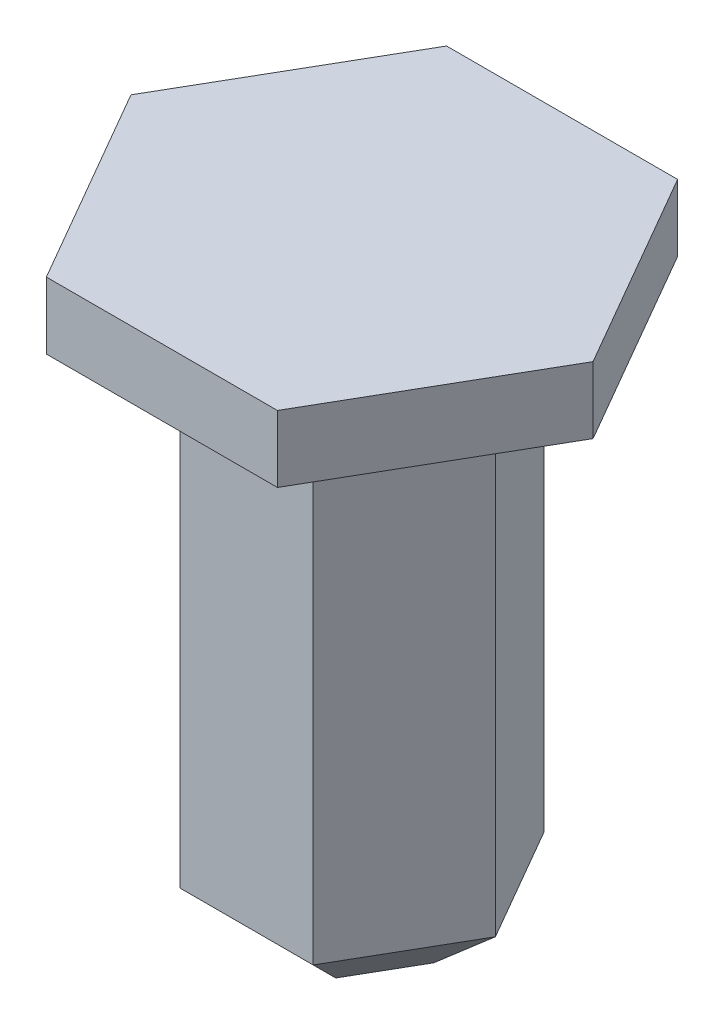
ISO-10303-21;
HEADER;
FILE_DESCRIPTION(('STEP AP214'),'2;1');
FILE_NAME('part.step','',(''),(''),'','','');
FILE_SCHEMA(('AUTOMOTIVE_DESIGN { 1 0 10303 214 1 1 1 1 }'));
ENDSEC;
DATA;
#1=APPLICATION_CONTEXT('core data for automotive mechanical design processes');
#2=APPLICATION_PROTOCOL_DEFINITION('international standard','automotive_design',2000,#1);
#3=PRODUCT_CONTEXT('',#1,'mechanical');
#4=PRODUCT('Part','Part','',(#3));
#5=PRODUCT_RELATED_PRODUCT_CATEGORY('part','',(#4));
#6=PRODUCT_DEFINITION_FORMATION('','',#4);
#7=PRODUCT_DEFINITION_CONTEXT('part definition',#1,'design');
#8=PRODUCT_DEFINITION('design','',#6,#7);
#9=PRODUCT_DEFINITION_SHAPE('','',#8);
#10=(LENGTH_UNIT() NAMED_UNIT(*) SI_UNIT(.MILLI.,.METRE.));
#11=(NAMED_UNIT(*) PLANE_ANGLE_UNIT() SI_UNIT($,.RADIAN.));
#12=(NAMED_UNIT(*) SI_UNIT($,.STERADIAN.) SOLID_ANGLE_UNIT());
#13=UNCERTAINTY_MEASURE_WITH_UNIT(LENGTH_MEASURE(1.E-05),#10,'distance_accuracy_value','');
#14=(GEOMETRIC_REPRESENTATION_CONTEXT(3) GLOBAL_UNCERTAINTY_ASSIGNED_CONTEXT((#13)) GLOBAL_UNIT_ASSIGNED_CONTEXT((#10,
#11,#12)) REPRESENTATION_CONTEXT('',''));
#15=CARTESIAN_POINT('',(0.,0.,0.));
#16=DIRECTION('',(0.,0.,1.));
#17=DIRECTION('',(1.,0.,0.));
#18=AXIS2_PLACEMENT_3D('',#15,#16,#17);
#19=CARTESIAN_POINT('',(1.,8.,1.73205080756888));
#20=DIRECTION('',(-0.866025403784439,0.,-0.5));
#21=DIRECTION('',(-0.5,0.,0.866025403784439));
#22=AXIS2_PLACEMENT_3D('',#19,#20,#21);
#23=PLANE('',#22);
#24=DIRECTION('',(0.,-1.,0.));
#25=VECTOR('',#24,1.);
#26=CARTESIAN_POINT('',(1.,8.,1.73205080756888));
#27=LINE('',#26,#25);
#28=CARTESIAN_POINT('',(1.,8.,1.73205080756888));
#29=VERTEX_POINT('',#28);
#30=CARTESIAN_POINT('',(1.,0.799999999999999,1.73205080756888));
#31=VERTEX_POINT('',#30);
#32=EDGE_CURVE('E196',#29,#31,#27,.T.);
#33=ORIENTED_EDGE('',*,*,#32,.T.);
#34=DIRECTION('',(0.5,0.,-0.866025403784439));
#35=VECTOR('',#34,1.);
#36=CARTESIAN_POINT('',(1.,0.799999999999999,1.73205080756888));
#37=LINE('',#36,#35);
#38=CARTESIAN_POINT('',(2.,0.799999999999999,0.));
#39=VERTEX_POINT('',#38);
#40=EDGE_CURVE('E11',#31,#39,#37,.T.);
#41=ORIENTED_EDGE('',*,*,#40,.T.);
#42=DIRECTION('',(0.,-1.,0.));
#43=VECTOR('',#42,1.);
#44=CARTESIAN_POINT('',(2.,8.,0.));
#45=LINE('',#44,#43);
#46=CARTESIAN_POINT('',(2.,8.,0.));
#47=VERTEX_POINT('',#46);
#48=EDGE_CURVE('E208',#47,#39,#45,.T.);
#49=ORIENTED_EDGE('',*,*,#48,.F.);
#50=DIRECTION('',(0.5,0.,-0.866025403784439));
#51=VECTOR('',#50,1.);
#52=CARTESIAN_POINT('',(1.,8.,1.73205080756888));
#53=LINE('',#52,#51);
#54=EDGE_CURVE('E178',#29,#47,#53,.T.);
#55=ORIENTED_EDGE('',*,*,#54,.F.);
#56=EDGE_LOOP('',(#33,#41,#49,#55));
#57=FACE_BOUND('',#56,.T.);
#58=ADVANCED_FACE('F35',(#57),#23,.F.);
#59=CARTESIAN_POINT('',(2.,8.,0.));
#60=DIRECTION('',(-0.866025403784439,0.,0.5));
#61=DIRECTION('',(0.5,0.,0.866025403784439));
#62=AXIS2_PLACEMENT_3D('',#59,#60,#61);
#63=PLANE('',#62);
#64=ORIENTED_EDGE('',*,*,#48,.T.);
#65=DIRECTION('',(-0.5,0.,-0.866025403784439));
#66=VECTOR('',#65,1.);
#67=CARTESIAN_POINT('',(2.,0.799999999999999,0.));
#68=LINE('',#67,#66);
#69=CARTESIAN_POINT('',(0.999999999999999,0.799999999999999,-1.73205080756888));
#70=VERTEX_POINT('',#69);
#71=EDGE_CURVE('E211',#39,#70,#68,.T.);
#72=ORIENTED_EDGE('',*,*,#71,.T.);
#73=DIRECTION('',(0.,-1.,0.));
#74=VECTOR('',#73,1.);
#75=CARTESIAN_POINT('',(0.999999999999999,8.,-1.73205080756888));
#76=LINE('',#75,#74);
#77=CARTESIAN_POINT('',(0.999999999999999,8.,-1.73205080756888));
#78=VERTEX_POINT('',#77);
#79=EDGE_CURVE('E205',#78,#70,#76,.T.);
#80=ORIENTED_EDGE('',*,*,#79,.F.);
#81=DIRECTION('',(-0.5,0.,-0.866025403784439));
#82=VECTOR('',#81,1.);
#83=CARTESIAN_POINT('',(2.,8.,0.));
#84=LINE('',#83,#82);
#85=EDGE_CURVE('E181',#47,#78,#84,.T.);
#86=ORIENTED_EDGE('',*,*,#85,.F.);
#87=EDGE_LOOP('',(#64,#72,#80,#86));
#88=FACE_BOUND('',#87,.T.);
#89=ADVANCED_FACE('F266',(#88),#63,.F.);
#90=CARTESIAN_POINT('',(0.999999999999999,8.,-1.73205080756888));
#91=DIRECTION('',(0.,0.,1.));
#92=DIRECTION('',(1.,0.,0.));
#93=AXIS2_PLACEMENT_3D('',#90,#91,#92);
#94=PLANE('',#93);
#95=ORIENTED_EDGE('',*,*,#79,.T.);
#96=DIRECTION('',(-1.,0.,0.));
#97=VECTOR('',#96,1.);
#98=CARTESIAN_POINT('',(0.999999999999999,0.799999999999999,-1.73205080756888));
#99=LINE('',#98,#97);
#100=CARTESIAN_POINT('',(-1.,0.799999999999999,-1.73205080756888));
#101=VERTEX_POINT('',#100);
#102=EDGE_CURVE('E227',#70,#101,#99,.T.);
#103=ORIENTED_EDGE('',*,*,#102,.T.);
#104=DIRECTION('',(0.,-1.,0.));
#105=VECTOR('',#104,1.);
#106=CARTESIAN_POINT('',(-1.,8.,-1.73205080756888));
#107=LINE('',#106,#105);
#108=CARTESIAN_POINT('',(-1.,8.,-1.73205080756888));
#109=VERTEX_POINT('',#108);
#110=EDGE_CURVE('E202',#109,#101,#107,.T.);
#111=ORIENTED_EDGE('',*,*,#110,.F.);
#112=DIRECTION('',(-1.,0.,0.));
#113=VECTOR('',#112,1.);
#114=CARTESIAN_POINT('',(0.999999999999999,8.,-1.73205080756888));
#115=LINE('',#114,#113);
#116=EDGE_CURVE('E184',#78,#109,#115,.T.);
#117=ORIENTED_EDGE('',*,*,#116,.F.);
#118=EDGE_LOOP('',(#95,#103,#111,#117));
#119=FACE_BOUND('',#118,.T.);
#120=ADVANCED_FACE('F300',(#119),#94,.F.);
#121=CARTESIAN_POINT('',(-1.,8.,-1.73205080756888));
#122=DIRECTION('',(0.866025403784439,0.,0.5));
#123=DIRECTION('',(0.5,0.,-0.866025403784439));
#124=AXIS2_PLACEMENT_3D('',#121,#122,#123);
#125=PLANE('',#124);
#126=ORIENTED_EDGE('',*,*,#110,.T.);
#127=DIRECTION('',(-0.5,0.,0.866025403784439));
#128=VECTOR('',#127,1.);
#129=CARTESIAN_POINT('',(-1.,0.799999999999999,-1.73205080756888));
#130=LINE('',#129,#128);
#131=CARTESIAN_POINT('',(-2.,0.799999999999999,0.));
#132=VERTEX_POINT('',#131);
#133=EDGE_CURVE('E229',#101,#132,#130,.T.);
#134=ORIENTED_EDGE('',*,*,#133,.T.);
#135=DIRECTION('',(0.,-1.,0.));
#136=VECTOR('',#135,1.);
#137=CARTESIAN_POINT('',(-2.,8.,0.));
#138=LINE('',#137,#136);
#139=CARTESIAN_POINT('',(-2.,8.,0.));
#140=VERTEX_POINT('',#139);
#141=EDGE_CURVE('E200',#140,#132,#138,.T.);
#142=ORIENTED_EDGE('',*,*,#141,.F.);
#143=DIRECTION('',(-0.5,0.,0.866025403784439));
#144=VECTOR('',#143,1.);
#145=CARTESIAN_POINT('',(-1.,8.,-1.73205080756888));
#146=LINE('',#145,#144);
#147=EDGE_CURVE('E187',#109,#140,#146,.T.);
#148=ORIENTED_EDGE('',*,*,#147,.F.);
#149=EDGE_LOOP('',(#126,#134,#142,#148));
#150=FACE_BOUND('',#149,.T.);
#151=ADVANCED_FACE('F276',(#150),#125,.F.);
#152=CARTESIAN_POINT('',(-2.,8.,0.));
#153=DIRECTION('',(0.866025403784438,0.,-0.5));
#154=DIRECTION('',(-0.5,0.,-0.866025403784439));
#155=AXIS2_PLACEMENT_3D('',#152,#153,#154);
#156=PLANE('',#155);
#157=ORIENTED_EDGE('',*,*,#141,.T.);
#158=DIRECTION('',(0.5,0.,0.866025403784439));
#159=VECTOR('',#158,1.);
#160=CARTESIAN_POINT('',(-2.,0.799999999999999,0.));
#161=LINE('',#160,#159);
#162=CARTESIAN_POINT('',(-0.999999999999998,0.799999999999999,1.73205080756888));
#163=VERTEX_POINT('',#162);
#164=EDGE_CURVE('E60',#132,#163,#161,.T.);
#165=ORIENTED_EDGE('',*,*,#164,.T.);
#166=DIRECTION('',(0.,-1.,0.));
#167=VECTOR('',#166,1.);
#168=CARTESIAN_POINT('',(-0.999999999999998,8.,1.73205080756888));
#169=LINE('',#168,#167);
#170=CARTESIAN_POINT('',(-0.999999999999998,8.,1.73205080756888));
#171=VERTEX_POINT('',#170);
#172=EDGE_CURVE('E198',#171,#163,#169,.T.);
#173=ORIENTED_EDGE('',*,*,#172,.F.);
#174=DIRECTION('',(0.5,0.,0.866025403784439));
#175=VECTOR('',#174,1.);
#176=CARTESIAN_POINT('',(-2.,8.,0.));
#177=LINE('',#176,#175);
#178=EDGE_CURVE('E190',#140,#171,#177,.T.);
#179=ORIENTED_EDGE('',*,*,#178,.F.);
#180=EDGE_LOOP('',(#157,#165,#173,#179));
#181=FACE_BOUND('',#180,.T.);
#182=ADVANCED_FACE('F274',(#181),#156,.F.);
#183=CARTESIAN_POINT('',(-0.999999999999998,8.,1.73205080756888));
#184=DIRECTION('',(0.,0.,-1.));
#185=DIRECTION('',(-1.,0.,0.));
#186=AXIS2_PLACEMENT_3D('',#183,#184,#185);
#187=PLANE('',#186);
#188=ORIENTED_EDGE('',*,*,#172,.T.);
#189=DIRECTION('',(1.,0.,0.));
#190=VECTOR('',#189,1.);
#191=CARTESIAN_POINT('',(-0.999999999999998,0.799999999999999,1.73205080756888));
#192=LINE('',#191,#190);
#193=EDGE_CURVE('E45',#163,#31,#192,.T.);
#194=ORIENTED_EDGE('',*,*,#193,.T.);
#195=ORIENTED_EDGE('',*,*,#32,.F.);
#196=DIRECTION('',(1.,0.,0.));
#197=VECTOR('',#196,1.);
#198=CARTESIAN_POINT('',(-0.999999999999998,8.,1.73205080756888));
#199=LINE('',#198,#197);
#200=EDGE_CURVE('E193',#171,#29,#199,.T.);
#201=ORIENTED_EDGE('',*,*,#200,.F.);
#202=EDGE_LOOP('',(#188,#194,#195,#201));
#203=FACE_BOUND('',#202,.T.);
#204=ADVANCED_FACE('F271',(#203),#187,.F.);
#205=CARTESIAN_POINT('',(0.,0.,0.));
#206=DIRECTION('',(0.,1.,0.));
#207=DIRECTION('',(0.,0.,1.));
#208=AXIS2_PLACEMENT_3D('',#205,#206,#207);
#209=PLANE('',#208);
#210=DIRECTION('',(1.,0.,0.));
#211=VECTOR('',#210,1.);
#212=CARTESIAN_POINT('',(0.,0.,-0.932050807568872));
#213=LINE('',#212,#211);
#214=CARTESIAN_POINT('',(-0.538119784648297,0.,-0.932050807568873));
#215=VERTEX_POINT('',#214);
#216=CARTESIAN_POINT('',(0.538119784648297,0.,-0.932050807568872));
#217=VERTEX_POINT('',#216);
#218=EDGE_CURVE('E222',#215,#217,#213,.T.);
#219=ORIENTED_EDGE('',*,*,#218,.T.);
#220=DIRECTION('',(0.5,0.,0.866025403784439));
#221=VECTOR('',#220,1.);
#222=CARTESIAN_POINT('',(0.807179676972445,0.,-0.466025403784437));
#223=LINE('',#222,#221);
#224=CARTESIAN_POINT('',(1.07623956929659,0.,0.));
#225=VERTEX_POINT('',#224);
#226=EDGE_CURVE('E224',#217,#225,#223,.T.);
#227=ORIENTED_EDGE('',*,*,#226,.T.);
#228=DIRECTION('',(-0.5,0.,0.866025403784439));
#229=VECTOR('',#228,1.);
#230=CARTESIAN_POINT('',(0.807179676972445,0.,0.466025403784436));
#231=LINE('',#230,#229);
#232=CARTESIAN_POINT('',(0.538119784648296,0.,0.932050807568873));
#233=VERTEX_POINT('',#232);
#234=EDGE_CURVE('E214',#225,#233,#231,.T.);
#235=ORIENTED_EDGE('',*,*,#234,.T.);
#236=DIRECTION('',(-1.,0.,0.));
#237=VECTOR('',#236,1.);
#238=CARTESIAN_POINT('',(0.,0.,0.932050807568874));
#239=LINE('',#238,#237);
#240=CARTESIAN_POINT('',(-0.538119784648297,0.,0.932050807568874));
#241=VERTEX_POINT('',#240);
#242=EDGE_CURVE('E216',#233,#241,#239,.T.);
#243=ORIENTED_EDGE('',*,*,#242,.T.);
#244=DIRECTION('',(-0.5,0.,-0.866025403784439));
#245=VECTOR('',#244,1.);
#246=CARTESIAN_POINT('',(-0.807179676972445,0.,0.466025403784437));
#247=LINE('',#246,#245);
#248=CARTESIAN_POINT('',(-1.07623956929659,0.,0.));
#249=VERTEX_POINT('',#248);
#250=EDGE_CURVE('E218',#241,#249,#247,.T.);
#251=ORIENTED_EDGE('',*,*,#250,.T.);
#252=DIRECTION('',(0.5,0.,-0.866025403784439));
#253=VECTOR('',#252,1.);
#254=CARTESIAN_POINT('',(-0.807179676972445,0.,-0.466025403784436));
#255=LINE('',#254,#253);
#256=EDGE_CURVE('E220',#249,#215,#255,.T.);
#257=ORIENTED_EDGE('',*,*,#256,.T.);
#258=EDGE_LOOP('',(#219,#227,#235,#243,#251,#257));
#259=FACE_BOUND('',#258,.T.);
#260=ADVANCED_FACE('F254',(#259),#209,.F.);
#261=CARTESIAN_POINT('',(-2.,0.799999999999999,0.));
#262=DIRECTION('',(0.612372435695793,0.707106781186549,-0.353553390593273));
#263=DIRECTION('',(0.5,0.,0.866025403784439));
#264=AXIS2_PLACEMENT_3D('',#261,#262,#263);
#265=PLANE('',#264);
#266=DIRECTION('',(0.755928946018456,-0.654653670707976,0.));
#267=VECTOR('',#266,1.);
#268=CARTESIAN_POINT('',(-2.,0.799999999999999,0.));
#269=LINE('',#268,#267);
#270=EDGE_CURVE('E239',#249,#132,#269,.F.);
#271=ORIENTED_EDGE('',*,*,#270,.F.);
#272=ORIENTED_EDGE('',*,*,#250,.F.);
#273=DIRECTION('',(0.377964473009227,-0.654653670707976,-0.654653670707979));
#274=VECTOR('',#273,1.);
#275=CARTESIAN_POINT('',(-0.999999999999998,0.799999999999999,1.73205080756888));
#276=LINE('',#275,#274);
#277=EDGE_CURVE('E40',#163,#241,#276,.T.);
#278=ORIENTED_EDGE('',*,*,#277,.F.);
#279=ORIENTED_EDGE('',*,*,#164,.F.);
#280=EDGE_LOOP('',(#271,#272,#278,#279));
#281=FACE_BOUND('',#280,.T.);
#282=ADVANCED_FACE('F38',(#281),#265,.F.);
#283=CARTESIAN_POINT('',(-0.999999999999998,0.799999999999999,1.73205080756888));
#284=DIRECTION('',(0.,0.707106781186549,-0.707106781186546));
#285=DIRECTION('',(1.,0.,0.));
#286=AXIS2_PLACEMENT_3D('',#283,#284,#285);
#287=PLANE('',#286);
#288=ORIENTED_EDGE('',*,*,#277,.T.);
#289=ORIENTED_EDGE('',*,*,#242,.F.);
#290=DIRECTION('',(-0.377964473009229,-0.654653670707975,-0.654653670707978));
#291=VECTOR('',#290,1.);
#292=CARTESIAN_POINT('',(1.,0.799999999999999,1.73205080756888));
#293=LINE('',#292,#291);
#294=EDGE_CURVE('E237',#31,#233,#293,.T.);
#295=ORIENTED_EDGE('',*,*,#294,.F.);
#296=ORIENTED_EDGE('',*,*,#193,.F.);
#297=EDGE_LOOP('',(#288,#289,#295,#296));
#298=FACE_BOUND('',#297,.T.);
#299=ADVANCED_FACE('F249',(#298),#287,.F.);
#300=CARTESIAN_POINT('',(-1.,0.799999999999999,-1.73205080756888));
#301=DIRECTION('',(0.612372435695793,0.707106781186549,0.353553390593273));
#302=DIRECTION('',(-0.5,0.,0.866025403784439));
#303=AXIS2_PLACEMENT_3D('',#300,#301,#302);
#304=PLANE('',#303);
#305=ORIENTED_EDGE('',*,*,#270,.T.);
#306=ORIENTED_EDGE('',*,*,#133,.F.);
#307=DIRECTION('',(0.377964473009228,-0.654653670707975,0.654653670707978));
#308=VECTOR('',#307,1.);
#309=CARTESIAN_POINT('',(-1.,0.799999999999999,-1.73205080756888));
#310=LINE('',#309,#308);
#311=EDGE_CURVE('E234',#215,#101,#310,.F.);
#312=ORIENTED_EDGE('',*,*,#311,.F.);
#313=ORIENTED_EDGE('',*,*,#256,.F.);
#314=EDGE_LOOP('',(#305,#306,#312,#313));
#315=FACE_BOUND('',#314,.T.);
#316=ADVANCED_FACE('F277',(#315),#304,.F.);
#317=CARTESIAN_POINT('',(1.,0.799999999999999,1.73205080756888));
#318=DIRECTION('',(-0.612372435695793,0.707106781186549,-0.353553390593273));
#319=DIRECTION('',(0.5,0.,-0.866025403784439));
#320=AXIS2_PLACEMENT_3D('',#317,#318,#319);
#321=PLANE('',#320);
#322=ORIENTED_EDGE('',*,*,#294,.T.);
#323=ORIENTED_EDGE('',*,*,#234,.F.);
#324=DIRECTION('',(0.755928946018456,0.654653670707975,0.));
#325=VECTOR('',#324,1.);
#326=CARTESIAN_POINT('',(1.42857142857143,0.305128340694608,0.));
#327=LINE('',#326,#325);
#328=EDGE_CURVE('E172',#39,#225,#327,.F.);
#329=ORIENTED_EDGE('',*,*,#328,.F.);
#330=ORIENTED_EDGE('',*,*,#40,.F.);
#331=EDGE_LOOP('',(#322,#323,#329,#330));
#332=FACE_BOUND('',#331,.T.);
#333=ADVANCED_FACE('F260',(#332),#321,.F.);
#334=CARTESIAN_POINT('',(0.999999999999999,0.799999999999999,-1.73205080756888));
#335=DIRECTION('',(0.,0.707106781186549,0.707106781186546));
#336=DIRECTION('',(-1.,0.,0.));
#337=AXIS2_PLACEMENT_3D('',#334,#335,#336);
#338=PLANE('',#337);
#339=ORIENTED_EDGE('',*,*,#311,.T.);
#340=ORIENTED_EDGE('',*,*,#102,.F.);
#341=DIRECTION('',(-0.377964473009228,-0.654653670707976,0.654653670707978));
#342=VECTOR('',#341,1.);
#343=CARTESIAN_POINT('',(0.999999999999999,0.799999999999999,-1.73205080756888));
#344=LINE('',#343,#342);
#345=EDGE_CURVE('E170',#217,#70,#344,.F.);
#346=ORIENTED_EDGE('',*,*,#345,.F.);
#347=ORIENTED_EDGE('',*,*,#218,.F.);
#348=EDGE_LOOP('',(#339,#340,#346,#347));
#349=FACE_BOUND('',#348,.T.);
#350=ADVANCED_FACE('F281',(#349),#338,.F.);
#351=CARTESIAN_POINT('',(2.,0.799999999999999,0.));
#352=DIRECTION('',(-0.612372435695793,0.707106781186549,0.353553390593273));
#353=DIRECTION('',(-0.5,0.,-0.866025403784439));
#354=AXIS2_PLACEMENT_3D('',#351,#352,#353);
#355=PLANE('',#354);
#356=ORIENTED_EDGE('',*,*,#328,.T.);
#357=ORIENTED_EDGE('',*,*,#226,.F.);
#358=ORIENTED_EDGE('',*,*,#345,.T.);
#359=ORIENTED_EDGE('',*,*,#71,.F.);
#360=EDGE_LOOP('',(#356,#357,#358,#359));
#361=FACE_BOUND('',#360,.T.);
#362=ADVANCED_FACE('F284',(#361),#355,.F.);
#363=CARTESIAN_POINT('',(0.,8.,0.));
#364=DIRECTION('',(0.,1.,0.));
#365=DIRECTION('',(0.,0.,1.));
#366=AXIS2_PLACEMENT_3D('',#363,#364,#365);
#367=PLANE('',#366);
#368=DIRECTION('',(-0.5,0.,0.866025403784439));
#369=VECTOR('',#368,1.);
#370=CARTESIAN_POINT('',(-1.73205080756888,8.,-3.));
#371=LINE('',#370,#369);
#372=CARTESIAN_POINT('',(-1.73205080756888,8.,-3.));
#373=VERTEX_POINT('',#372);
#374=CARTESIAN_POINT('',(-3.46410161513775,8.,0.));
#375=VERTEX_POINT('',#374);
#376=EDGE_CURVE('E169',#373,#375,#371,.T.);
#377=ORIENTED_EDGE('',*,*,#376,.F.);
#378=DIRECTION('',(-1.,0.,0.));
#379=VECTOR('',#378,1.);
#380=CARTESIAN_POINT('',(1.73205080756888,8.,-3.));
#381=LINE('',#380,#379);
#382=CARTESIAN_POINT('',(1.73205080756888,8.,-3.));
#383=VERTEX_POINT('',#382);
#384=EDGE_CURVE('E165',#383,#373,#381,.T.);
#385=ORIENTED_EDGE('',*,*,#384,.F.);
#386=DIRECTION('',(-0.5,0.,-0.866025403784439));
#387=VECTOR('',#386,1.);
#388=CARTESIAN_POINT('',(3.46410161513775,8.,0.));
#389=LINE('',#388,#387);
#390=CARTESIAN_POINT('',(3.46410161513775,8.,0.));
#391=VERTEX_POINT('',#390);
#392=EDGE_CURVE('E485',#391,#383,#389,.T.);
#393=ORIENTED_EDGE('',*,*,#392,.F.);
#394=DIRECTION('',(0.5,0.,-0.866025403784439));
#395=VECTOR('',#394,1.);
#396=CARTESIAN_POINT('',(1.73205080756888,8.,3.));
#397=LINE('',#396,#395);
#398=CARTESIAN_POINT('',(1.73205080756888,8.,3.));
#399=VERTEX_POINT('',#398);
#400=EDGE_CURVE('E497',#399,#391,#397,.T.);
#401=ORIENTED_EDGE('',*,*,#400,.F.);
#402=DIRECTION('',(1.,0.,0.));
#403=VECTOR('',#402,1.);
#404=CARTESIAN_POINT('',(-1.73205080756888,8.,3.));
#405=LINE('',#404,#403);
#406=CARTESIAN_POINT('',(-1.73205080756888,8.,3.));
#407=VERTEX_POINT('',#406);
#408=EDGE_CURVE('E491',#407,#399,#405,.T.);
#409=ORIENTED_EDGE('',*,*,#408,.F.);
#410=DIRECTION('',(0.5,0.,0.866025403784439));
#411=VECTOR('',#410,1.);
#412=CARTESIAN_POINT('',(-3.46410161513775,8.,0.));
#413=LINE('',#412,#411);
#414=EDGE_CURVE('E489',#375,#407,#413,.T.);
#415=ORIENTED_EDGE('',*,*,#414,.F.);
#416=EDGE_LOOP('',(#377,#385,#393,#401,#409,#415));
#417=FACE_BOUND('',#416,.T.);
#418=ORIENTED_EDGE('',*,*,#200,.T.);
#419=ORIENTED_EDGE('',*,*,#54,.T.);
#420=ORIENTED_EDGE('',*,*,#85,.T.);
#421=ORIENTED_EDGE('',*,*,#116,.T.);
#422=ORIENTED_EDGE('',*,*,#147,.T.);
#423=ORIENTED_EDGE('',*,*,#178,.T.);
#424=EDGE_LOOP('',(#418,#419,#420,#421,#422,#423));
#425=FACE_BOUND('',#424,.T.);
#426=ADVANCED_FACE('F269',(#417,#425),#367,.F.);
#427=CARTESIAN_POINT('',(-1.73205080756888,9.,-3.));
#428=DIRECTION('',(0.866025403784439,0.,0.5));
#429=DIRECTION('',(0.5,0.,-0.866025403784439));
#430=AXIS2_PLACEMENT_3D('',#427,#428,#429);
#431=PLANE('',#430);
#432=ORIENTED_EDGE('',*,*,#376,.T.);
#433=DIRECTION('',(0.,-1.,0.));
#434=VECTOR('',#433,1.);
#435=CARTESIAN_POINT('',(-3.46410161513775,9.,0.));
#436=LINE('',#435,#434);
#437=CARTESIAN_POINT('',(-3.46410161513775,9.,0.));
#438=VERTEX_POINT('',#437);
#439=EDGE_CURVE('E149',#438,#375,#436,.T.);
#440=ORIENTED_EDGE('',*,*,#439,.F.);
#441=DIRECTION('',(-0.5,0.,0.866025403784439));
#442=VECTOR('',#441,1.);
#443=CARTESIAN_POINT('',(-1.73205080756888,9.,-3.));
#444=LINE('',#443,#442);
#445=CARTESIAN_POINT('',(-1.73205080756888,9.,-3.));
#446=VERTEX_POINT('',#445);
#447=EDGE_CURVE('E156',#446,#438,#444,.T.);
#448=ORIENTED_EDGE('',*,*,#447,.F.);
#449=DIRECTION('',(0.,-1.,0.));
#450=VECTOR('',#449,1.);
#451=CARTESIAN_POINT('',(-1.73205080756888,9.,-3.));
#452=LINE('',#451,#450);
#453=EDGE_CURVE('E481',#446,#373,#452,.T.);
#454=ORIENTED_EDGE('',*,*,#453,.T.);
#455=EDGE_LOOP('',(#432,#440,#448,#454));
#456=FACE_BOUND('',#455,.T.);
#457=ADVANCED_FACE('F167',(#456),#431,.F.);
#458=CARTESIAN_POINT('',(-3.46410161513775,9.,0.));
#459=DIRECTION('',(0.866025403784439,0.,-0.5));
#460=DIRECTION('',(-0.5,0.,-0.866025403784439));
#461=AXIS2_PLACEMENT_3D('',#458,#459,#460);
#462=PLANE('',#461);
#463=ORIENTED_EDGE('',*,*,#414,.T.);
#464=DIRECTION('',(0.,-1.,0.));
#465=VECTOR('',#464,1.);
#466=CARTESIAN_POINT('',(-1.73205080756888,9.,3.));
#467=LINE('',#466,#465);
#468=CARTESIAN_POINT('',(-1.73205080756888,9.,3.));
#469=VERTEX_POINT('',#468);
#470=EDGE_CURVE('E152',#469,#407,#467,.T.);
#471=ORIENTED_EDGE('',*,*,#470,.F.);
#472=DIRECTION('',(0.5,0.,0.866025403784439));
#473=VECTOR('',#472,1.);
#474=CARTESIAN_POINT('',(-3.46410161513775,9.,0.));
#475=LINE('',#474,#473);
#476=EDGE_CURVE('E145',#438,#469,#475,.T.);
#477=ORIENTED_EDGE('',*,*,#476,.F.);
#478=ORIENTED_EDGE('',*,*,#439,.T.);
#479=EDGE_LOOP('',(#463,#471,#477,#478));
#480=FACE_BOUND('',#479,.T.);
#481=ADVANCED_FACE('F147',(#480),#462,.F.);
#482=CARTESIAN_POINT('',(-1.73205080756888,9.,3.));
#483=DIRECTION('',(0.,0.,-1.));
#484=DIRECTION('',(-1.,0.,0.));
#485=AXIS2_PLACEMENT_3D('',#482,#483,#484);
#486=PLANE('',#485);
#487=ORIENTED_EDGE('',*,*,#408,.T.);
#488=DIRECTION('',(0.,-1.,0.));
#489=VECTOR('',#488,1.);
#490=CARTESIAN_POINT('',(1.73205080756888,9.,3.));
#491=LINE('',#490,#489);
#492=CARTESIAN_POINT('',(1.73205080756888,9.,3.));
#493=VERTEX_POINT('',#492);
#494=EDGE_CURVE('E174',#493,#399,#491,.T.);
#495=ORIENTED_EDGE('',*,*,#494,.F.);
#496=DIRECTION('',(1.,0.,0.));
#497=VECTOR('',#496,1.);
#498=CARTESIAN_POINT('',(-1.73205080756888,9.,3.));
#499=LINE('',#498,#497);
#500=EDGE_CURVE('E155',#469,#493,#499,.T.);
#501=ORIENTED_EDGE('',*,*,#500,.F.);
#502=ORIENTED_EDGE('',*,*,#470,.T.);
#503=EDGE_LOOP('',(#487,#495,#501,#502));
#504=FACE_BOUND('',#503,.T.);
#505=ADVANCED_FACE('F318',(#504),#486,.F.);
#506=CARTESIAN_POINT('',(1.73205080756888,9.,3.));
#507=DIRECTION('',(-0.866025403784439,0.,-0.5));
#508=DIRECTION('',(-0.5,0.,0.866025403784439));
#509=AXIS2_PLACEMENT_3D('',#506,#507,#508);
#510=PLANE('',#509);
#511=ORIENTED_EDGE('',*,*,#400,.T.);
#512=DIRECTION('',(0.,-1.,0.));
#513=VECTOR('',#512,1.);
#514=CARTESIAN_POINT('',(3.46410161513775,9.,0.));
#515=LINE('',#514,#513);
#516=CARTESIAN_POINT('',(3.46410161513775,9.,0.));
#517=VERTEX_POINT('',#516);
#518=EDGE_CURVE('E501',#517,#391,#515,.T.);
#519=ORIENTED_EDGE('',*,*,#518,.F.);
#520=DIRECTION('',(0.5,0.,-0.866025403784439));
#521=VECTOR('',#520,1.);
#522=CARTESIAN_POINT('',(1.73205080756888,9.,3.));
#523=LINE('',#522,#521);
#524=EDGE_CURVE('E508',#493,#517,#523,.T.);
#525=ORIENTED_EDGE('',*,*,#524,.F.);
#526=ORIENTED_EDGE('',*,*,#494,.T.);
#527=EDGE_LOOP('',(#511,#519,#525,#526));
#528=FACE_BOUND('',#527,.T.);
#529=ADVANCED_FACE('F321',(#528),#510,.F.);
#530=CARTESIAN_POINT('',(3.46410161513775,9.,0.));
#531=DIRECTION('',(-0.866025403784439,0.,0.5));
#532=DIRECTION('',(0.5,0.,0.866025403784439));
#533=AXIS2_PLACEMENT_3D('',#530,#531,#532);
#534=PLANE('',#533);
#535=ORIENTED_EDGE('',*,*,#392,.T.);
#536=DIRECTION('',(0.,-1.,0.));
#537=VECTOR('',#536,1.);
#538=CARTESIAN_POINT('',(1.73205080756888,9.,-3.));
#539=LINE('',#538,#537);
#540=CARTESIAN_POINT('',(1.73205080756888,9.,-3.));
#541=VERTEX_POINT('',#540);
#542=EDGE_CURVE('E483',#541,#383,#539,.T.);
#543=ORIENTED_EDGE('',*,*,#542,.F.);
#544=DIRECTION('',(-0.5,0.,-0.866025403784439));
#545=VECTOR('',#544,1.);
#546=CARTESIAN_POINT('',(3.46410161513775,9.,0.));
#547=LINE('',#546,#545);
#548=EDGE_CURVE('E510',#517,#541,#547,.T.);
#549=ORIENTED_EDGE('',*,*,#548,.F.);
#550=ORIENTED_EDGE('',*,*,#518,.T.);
#551=EDGE_LOOP('',(#535,#543,#549,#550));
#552=FACE_BOUND('',#551,.T.);
#553=ADVANCED_FACE('F325',(#552),#534,.F.);
#554=CARTESIAN_POINT('',(1.73205080756888,9.,-3.));
#555=DIRECTION('',(0.,0.,1.));
#556=DIRECTION('',(1.,0.,0.));
#557=AXIS2_PLACEMENT_3D('',#554,#555,#556);
#558=PLANE('',#557);
#559=ORIENTED_EDGE('',*,*,#384,.T.);
#560=ORIENTED_EDGE('',*,*,#453,.F.);
#561=DIRECTION('',(-1.,0.,0.));
#562=VECTOR('',#561,1.);
#563=CARTESIAN_POINT('',(1.73205080756888,9.,-3.));
#564=LINE('',#563,#562);
#565=EDGE_CURVE('E161',#541,#446,#564,.T.);
#566=ORIENTED_EDGE('',*,*,#565,.F.);
#567=ORIENTED_EDGE('',*,*,#542,.T.);
#568=EDGE_LOOP('',(#559,#560,#566,#567));
#569=FACE_BOUND('',#568,.T.);
#570=ADVANCED_FACE('F329',(#569),#558,.F.);
#571=CARTESIAN_POINT('',(0.,9.,0.));
#572=DIRECTION('',(0.,1.,0.));
#573=DIRECTION('',(0.,0.,1.));
#574=AXIS2_PLACEMENT_3D('',#571,#572,#573);
#575=PLANE('',#574);
#576=ORIENTED_EDGE('',*,*,#447,.T.);
#577=ORIENTED_EDGE('',*,*,#476,.T.);
#578=ORIENTED_EDGE('',*,*,#500,.T.);
#579=ORIENTED_EDGE('',*,*,#524,.T.);
#580=ORIENTED_EDGE('',*,*,#548,.T.);
#581=ORIENTED_EDGE('',*,*,#565,.T.);
#582=EDGE_LOOP('',(#576,#577,#578,#579,#580,#581));
#583=FACE_BOUND('',#582,.T.);
#584=ADVANCED_FACE('F159',(#583),#575,.T.);
#585=CLOSED_SHELL('',(#58,#89,#120,#151,#182,#204,#260,#282,#299,#316,#333,#350,#362,#426,#457,
#481,#505,#529,#553,#570,#584));
#586=MANIFOLD_SOLID_BREP('B2',#585);
#587=ADVANCED_BREP_SHAPE_REPRESENTATION('',(#18,#586),#14);
#588=SHAPE_DEFINITION_REPRESENTATION(#9,#587);
ENDSEC;
END-ISO-10303-21;
